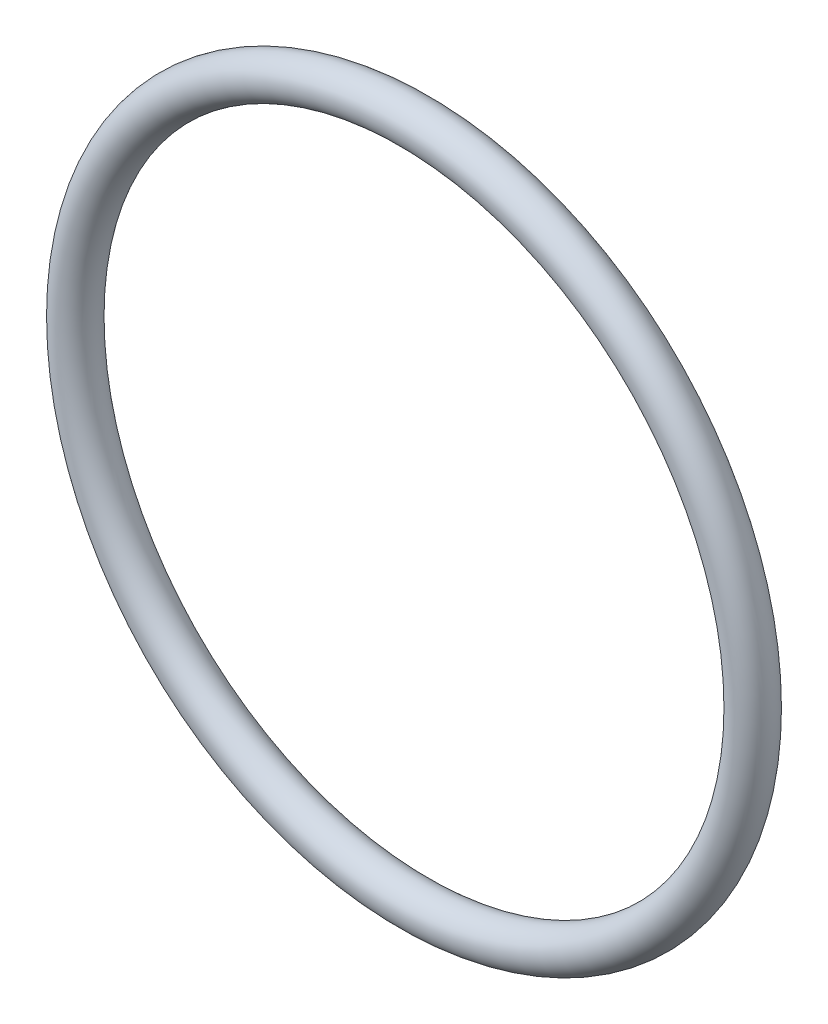
ISO-10303-21;
HEADER;
FILE_DESCRIPTION(('STEP AP214'),'2;1');
FILE_NAME('part.step','',(''),(''),'','','');
FILE_SCHEMA(('AUTOMOTIVE_DESIGN { 1 0 10303 214 1 1 1 1 }'));
ENDSEC;
DATA;
#1=APPLICATION_CONTEXT('core data for automotive mechanical design processes');
#2=APPLICATION_PROTOCOL_DEFINITION('international standard','automotive_design',2000,#1);
#3=PRODUCT_CONTEXT('',#1,'mechanical');
#4=PRODUCT('Part','Part','',(#3));
#5=PRODUCT_RELATED_PRODUCT_CATEGORY('part','',(#4));
#6=PRODUCT_DEFINITION_FORMATION('','',#4);
#7=PRODUCT_DEFINITION_CONTEXT('part definition',#1,'design');
#8=PRODUCT_DEFINITION('design','',#6,#7);
#9=PRODUCT_DEFINITION_SHAPE('','',#8);
#10=(LENGTH_UNIT() NAMED_UNIT(*) SI_UNIT(.MILLI.,.METRE.));
#11=(NAMED_UNIT(*) PLANE_ANGLE_UNIT() SI_UNIT($,.RADIAN.));
#12=(NAMED_UNIT(*) SI_UNIT($,.STERADIAN.) SOLID_ANGLE_UNIT());
#13=UNCERTAINTY_MEASURE_WITH_UNIT(LENGTH_MEASURE(1.E-05),#10,'distance_accuracy_value','');
#14=(GEOMETRIC_REPRESENTATION_CONTEXT(3) GLOBAL_UNCERTAINTY_ASSIGNED_CONTEXT((#13)) GLOBAL_UNIT_ASSIGNED_CONTEXT((#10,
#11,#12)) REPRESENTATION_CONTEXT('',''));
#15=CARTESIAN_POINT('',(0.,0.,0.));
#16=DIRECTION('',(0.,0.,1.));
#17=DIRECTION('',(1.,0.,0.));
#18=AXIS2_PLACEMENT_3D('',#15,#16,#17);
#19=CARTESIAN_POINT('',(0.,0.,0.));
#20=DIRECTION('',(0.,0.,1.));
#21=DIRECTION('',(1.,0.,0.));
#22=AXIS2_PLACEMENT_3D('',#19,#20,#21);
#23=TOROIDAL_SURFACE('',#22,21.7805,1.3081);
#24=CARTESIAN_POINT('',(23.0886,0.,0.));
#25=VERTEX_POINT('',#24);
#26=VERTEX_LOOP('',#25);
#27=FACE_BOUND('',#26,.T.);
#28=ADVANCED_FACE('F26',(#27),#23,.T.);
#29=CLOSED_SHELL('',(#28));
#30=MANIFOLD_SOLID_BREP('B2',#29);
#31=ADVANCED_BREP_SHAPE_REPRESENTATION('',(#18,#30),#14);
#32=SHAPE_DEFINITION_REPRESENTATION(#9,#31);
ENDSEC;
END-ISO-10303-21;
